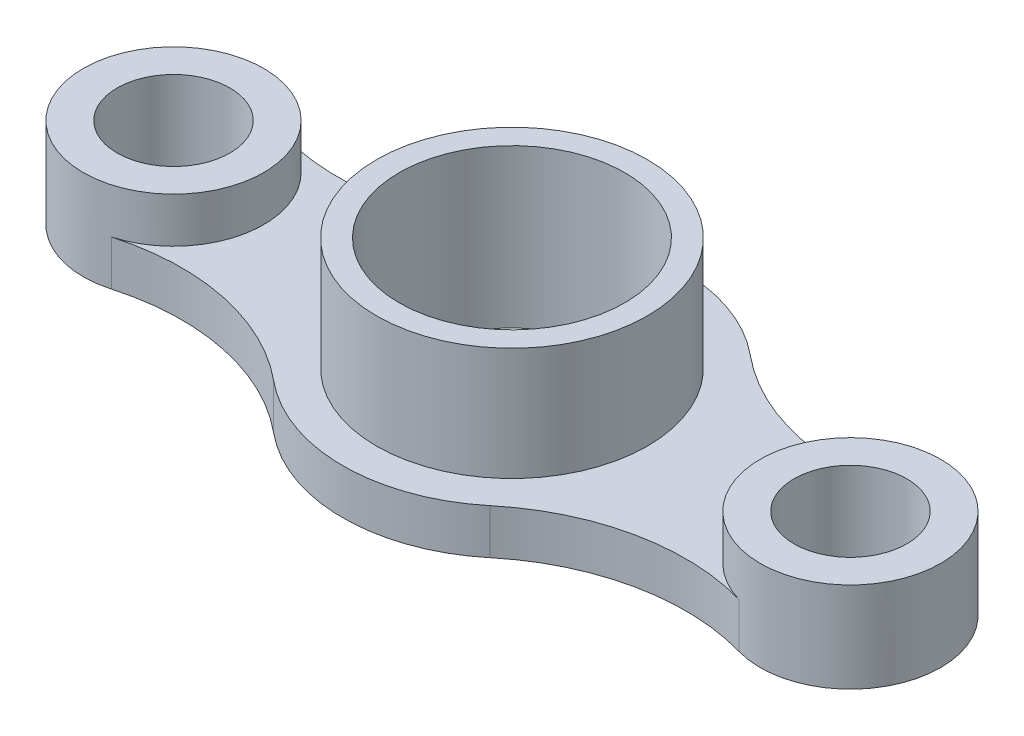
ISO-10303-21;
HEADER;
FILE_DESCRIPTION(('STEP AP214'),'2;1');
FILE_NAME('part.step','',(''),(''),'','','');
FILE_SCHEMA(('AUTOMOTIVE_DESIGN { 1 0 10303 214 1 1 1 1 }'));
ENDSEC;
DATA;
#1=APPLICATION_CONTEXT('core data for automotive mechanical design processes');
#2=APPLICATION_PROTOCOL_DEFINITION('international standard','automotive_design',2000,#1);
#3=PRODUCT_CONTEXT('',#1,'mechanical');
#4=PRODUCT('Part','Part','',(#3));
#5=PRODUCT_RELATED_PRODUCT_CATEGORY('part','',(#4));
#6=PRODUCT_DEFINITION_FORMATION('','',#4);
#7=PRODUCT_DEFINITION_CONTEXT('part definition',#1,'design');
#8=PRODUCT_DEFINITION('design','',#6,#7);
#9=PRODUCT_DEFINITION_SHAPE('','',#8);
#10=(LENGTH_UNIT() NAMED_UNIT(*) SI_UNIT(.MILLI.,.METRE.));
#11=(NAMED_UNIT(*) PLANE_ANGLE_UNIT() SI_UNIT($,.RADIAN.));
#12=(NAMED_UNIT(*) SI_UNIT($,.STERADIAN.) SOLID_ANGLE_UNIT());
#13=UNCERTAINTY_MEASURE_WITH_UNIT(LENGTH_MEASURE(1.E-05),#10,'distance_accuracy_value','');
#14=(GEOMETRIC_REPRESENTATION_CONTEXT(3) GLOBAL_UNCERTAINTY_ASSIGNED_CONTEXT((#13)) GLOBAL_UNIT_ASSIGNED_CONTEXT((#10,
#11,#12)) REPRESENTATION_CONTEXT('',''));
#15=CARTESIAN_POINT('',(0.,0.,0.));
#16=DIRECTION('',(0.,0.,1.));
#17=DIRECTION('',(1.,0.,0.));
#18=AXIS2_PLACEMENT_3D('',#15,#16,#17);
#19=CARTESIAN_POINT('',(0.,20.,0.));
#20=DIRECTION('',(0.,-1.,0.));
#21=DIRECTION('',(0.,0.,-1.));
#22=AXIS2_PLACEMENT_3D('',#19,#20,#21);
#23=CYLINDRICAL_SURFACE('',#22,75.0000000000001);
#24=CARTESIAN_POINT('',(0.,0.,0.));
#25=DIRECTION('',(0.,1.,0.));
#26=DIRECTION('',(0.,0.,1.));
#27=AXIS2_PLACEMENT_3D('',#24,#25,#26);
#28=CIRCLE('',#27,75.0000000000001);
#29=CARTESIAN_POINT('',(-47.8928571428572,0.,57.7171918469176));
#30=VERTEX_POINT('',#29);
#31=CARTESIAN_POINT('',(47.8928571428575,0.,57.7171918469174));
#32=VERTEX_POINT('',#31);
#33=EDGE_CURVE('E138',#30,#32,#28,.T.);
#34=ORIENTED_EDGE('',*,*,#33,.T.);
#35=DIRECTION('',(0.,-1.,0.));
#36=VECTOR('',#35,1.);
#37=CARTESIAN_POINT('',(47.8928571428575,20.,57.7171918469174));
#38=LINE('',#37,#36);
#39=CARTESIAN_POINT('',(47.8928571428575,20.,57.7171918469174));
#40=VERTEX_POINT('',#39);
#41=EDGE_CURVE('E11',#40,#32,#38,.T.);
#42=ORIENTED_EDGE('',*,*,#41,.F.);
#43=CARTESIAN_POINT('',(0.,20.,0.));
#44=DIRECTION('',(0.,1.,0.));
#45=DIRECTION('',(0.,0.,1.));
#46=AXIS2_PLACEMENT_3D('',#43,#44,#45);
#47=CIRCLE('',#46,75.0000000000001);
#48=CARTESIAN_POINT('',(-47.8928571428572,20.,57.7171918469176));
#49=VERTEX_POINT('',#48);
#50=EDGE_CURVE('E91',#49,#40,#47,.T.);
#51=ORIENTED_EDGE('',*,*,#50,.F.);
#52=DIRECTION('',(0.,-1.,0.));
#53=VECTOR('',#52,1.);
#54=CARTESIAN_POINT('',(-47.8928571428572,20.,57.7171918469176));
#55=LINE('',#54,#53);
#56=EDGE_CURVE('E137',#49,#30,#55,.T.);
#57=ORIENTED_EDGE('',*,*,#56,.T.);
#58=EDGE_LOOP('',(#34,#42,#51,#57));
#59=FACE_BOUND('',#58,.T.);
#60=ADVANCED_FACE('F39',(#59),#23,.T.);
#61=CARTESIAN_POINT('',(111.750000000001,20.,134.673447642807));
#62=DIRECTION('',(0.,-1.,0.));
#63=DIRECTION('',(0.,0.,-1.));
#64=AXIS2_PLACEMENT_3D('',#61,#62,#63);
#65=CYLINDRICAL_SURFACE('',#64,100.000000000001);
#66=CARTESIAN_POINT('',(111.750000000001,0.,134.673447642807));
#67=DIRECTION('',(0.,1.,0.));
#68=DIRECTION('',(0.,0.,1.));
#69=AXIS2_PLACEMENT_3D('',#66,#67,#68);
#70=CIRCLE('',#69,100.000000000001);
#71=CARTESIAN_POINT('',(139.071428571429,0.,38.4781278979438));
#72=VERTEX_POINT('',#71);
#73=EDGE_CURVE('E141',#72,#32,#70,.T.);
#74=ORIENTED_EDGE('',*,*,#73,.F.);
#75=DIRECTION('',(0.,-1.,0.));
#76=VECTOR('',#75,1.);
#77=CARTESIAN_POINT('',(139.071428571429,20.,38.4781278979438));
#78=LINE('',#77,#76);
#79=CARTESIAN_POINT('',(139.071428571429,20.,38.4781278979438));
#80=VERTEX_POINT('',#79);
#81=EDGE_CURVE('E47',#80,#72,#78,.T.);
#82=ORIENTED_EDGE('',*,*,#81,.F.);
#83=CARTESIAN_POINT('',(111.750000000001,20.,134.673447642807));
#84=DIRECTION('',(0.,1.,0.));
#85=DIRECTION('',(0.,0.,1.));
#86=AXIS2_PLACEMENT_3D('',#83,#84,#85);
#87=CIRCLE('',#86,100.000000000001);
#88=EDGE_CURVE('E196',#80,#40,#87,.T.);
#89=ORIENTED_EDGE('',*,*,#88,.T.);
#90=ORIENTED_EDGE('',*,*,#41,.T.);
#91=EDGE_LOOP('',(#74,#82,#89,#90));
#92=FACE_BOUND('',#91,.T.);
#93=ADVANCED_FACE('F197',(#92),#65,.F.);
#94=CARTESIAN_POINT('',(111.749999999999,20.,-134.673447642807));
#95=DIRECTION('',(0.,-1.,0.));
#96=DIRECTION('',(0.,0.,-1.));
#97=AXIS2_PLACEMENT_3D('',#94,#95,#96);
#98=CYLINDRICAL_SURFACE('',#97,99.9999999999991);
#99=CARTESIAN_POINT('',(111.749999999999,0.,-134.673447642807));
#100=DIRECTION('',(0.,1.,0.));
#101=DIRECTION('',(0.,0.,1.));
#102=AXIS2_PLACEMENT_3D('',#99,#100,#101);
#103=CIRCLE('',#102,99.9999999999991);
#104=CARTESIAN_POINT('',(139.071428571428,0.,-38.4781278979463));
#105=VERTEX_POINT('',#104);
#106=CARTESIAN_POINT('',(47.8928571428572,0.,-57.7171918469179));
#107=VERTEX_POINT('',#106);
#108=EDGE_CURVE('E119',#105,#107,#103,.F.);
#109=ORIENTED_EDGE('',*,*,#108,.T.);
#110=DIRECTION('',(0.,-1.,0.));
#111=VECTOR('',#110,1.);
#112=CARTESIAN_POINT('',(47.8928571428572,20.,-57.7171918469179));
#113=LINE('',#112,#111);
#114=CARTESIAN_POINT('',(47.8928571428572,20.,-57.7171918469179));
#115=VERTEX_POINT('',#114);
#116=EDGE_CURVE('E116',#115,#107,#113,.T.);
#117=ORIENTED_EDGE('',*,*,#116,.F.);
#118=CARTESIAN_POINT('',(111.749999999999,20.,-134.673447642807));
#119=DIRECTION('',(0.,1.,0.));
#120=DIRECTION('',(0.,0.,1.));
#121=AXIS2_PLACEMENT_3D('',#118,#119,#120);
#122=CIRCLE('',#121,99.9999999999991);
#123=CARTESIAN_POINT('',(139.071428571428,20.,-38.4781278979462));
#124=VERTEX_POINT('',#123);
#125=EDGE_CURVE('E102',#124,#115,#122,.F.);
#126=ORIENTED_EDGE('',*,*,#125,.F.);
#127=DIRECTION('',(0.,-1.,0.));
#128=VECTOR('',#127,1.);
#129=CARTESIAN_POINT('',(139.071428571428,20.,-38.4781278979462));
#130=LINE('',#129,#128);
#131=EDGE_CURVE('E123',#124,#105,#130,.T.);
#132=ORIENTED_EDGE('',*,*,#131,.T.);
#133=EDGE_LOOP('',(#109,#117,#126,#132));
#134=FACE_BOUND('',#133,.T.);
#135=ADVANCED_FACE('F117',(#134),#98,.F.);
#136=CARTESIAN_POINT('',(0.,20.,0.));
#137=DIRECTION('',(0.,-1.,0.));
#138=DIRECTION('',(0.,0.,-1.));
#139=AXIS2_PLACEMENT_3D('',#136,#137,#138);
#140=CYLINDRICAL_SURFACE('',#139,74.9999999999999);
#141=CARTESIAN_POINT('',(0.,0.,0.));
#142=DIRECTION('',(0.,1.,0.));
#143=DIRECTION('',(0.,0.,1.));
#144=AXIS2_PLACEMENT_3D('',#141,#142,#143);
#145=CIRCLE('',#144,74.9999999999999);
#146=CARTESIAN_POINT('',(-47.8928571428571,0.,-57.7171918469175));
#147=VERTEX_POINT('',#146);
#148=EDGE_CURVE('E146',#107,#147,#145,.T.);
#149=ORIENTED_EDGE('',*,*,#148,.T.);
#150=DIRECTION('',(0.,-1.,0.));
#151=VECTOR('',#150,1.);
#152=CARTESIAN_POINT('',(-47.8928571428571,20.,-57.7171918469175));
#153=LINE('',#152,#151);
#154=CARTESIAN_POINT('',(-47.8928571428571,20.,-57.7171918469175));
#155=VERTEX_POINT('',#154);
#156=EDGE_CURVE('E124',#155,#147,#153,.T.);
#157=ORIENTED_EDGE('',*,*,#156,.F.);
#158=CARTESIAN_POINT('',(0.,20.,0.));
#159=DIRECTION('',(0.,1.,0.));
#160=DIRECTION('',(0.,0.,1.));
#161=AXIS2_PLACEMENT_3D('',#158,#159,#160);
#162=CIRCLE('',#161,74.9999999999999);
#163=EDGE_CURVE('E107',#115,#155,#162,.T.);
#164=ORIENTED_EDGE('',*,*,#163,.F.);
#165=ORIENTED_EDGE('',*,*,#116,.T.);
#166=EDGE_LOOP('',(#149,#157,#164,#165));
#167=FACE_BOUND('',#166,.T.);
#168=ADVANCED_FACE('F126',(#167),#140,.T.);
#169=CARTESIAN_POINT('',(-111.75,20.,-134.673447642807));
#170=DIRECTION('',(0.,-1.,0.));
#171=DIRECTION('',(0.,0.,-1.));
#172=AXIS2_PLACEMENT_3D('',#169,#170,#171);
#173=CYLINDRICAL_SURFACE('',#172,100.);
#174=CARTESIAN_POINT('',(-111.75,0.,-134.673447642807));
#175=DIRECTION('',(0.,1.,0.));
#176=DIRECTION('',(0.,0.,1.));
#177=AXIS2_PLACEMENT_3D('',#174,#175,#176);
#178=CIRCLE('',#177,100.);
#179=CARTESIAN_POINT('',(-139.071428571429,0.,-38.478127897945));
#180=VERTEX_POINT('',#179);
#181=EDGE_CURVE('E148',#180,#147,#178,.T.);
#182=ORIENTED_EDGE('',*,*,#181,.F.);
#183=DIRECTION('',(0.,-1.,0.));
#184=VECTOR('',#183,1.);
#185=CARTESIAN_POINT('',(-139.071428571429,20.,-38.478127897945));
#186=LINE('',#185,#184);
#187=CARTESIAN_POINT('',(-139.071428571429,20.,-38.478127897945));
#188=VERTEX_POINT('',#187);
#189=EDGE_CURVE('E155',#188,#180,#186,.T.);
#190=ORIENTED_EDGE('',*,*,#189,.F.);
#191=CARTESIAN_POINT('',(-111.75,20.,-134.673447642807));
#192=DIRECTION('',(0.,1.,0.));
#193=DIRECTION('',(0.,0.,1.));
#194=AXIS2_PLACEMENT_3D('',#191,#192,#193);
#195=CIRCLE('',#194,100.);
#196=EDGE_CURVE('E128',#188,#155,#195,.T.);
#197=ORIENTED_EDGE('',*,*,#196,.T.);
#198=ORIENTED_EDGE('',*,*,#156,.T.);
#199=EDGE_LOOP('',(#182,#190,#197,#198));
#200=FACE_BOUND('',#199,.T.);
#201=ADVANCED_FACE('F210',(#200),#173,.F.);
#202=CARTESIAN_POINT('',(-111.75,20.,134.673447642807));
#203=DIRECTION('',(0.,-1.,0.));
#204=DIRECTION('',(0.,0.,-1.));
#205=AXIS2_PLACEMENT_3D('',#202,#203,#204);
#206=CYLINDRICAL_SURFACE('',#205,100.);
#207=CARTESIAN_POINT('',(-111.75,0.,134.673447642807));
#208=DIRECTION('',(0.,1.,0.));
#209=DIRECTION('',(0.,0.,1.));
#210=AXIS2_PLACEMENT_3D('',#207,#208,#209);
#211=CIRCLE('',#210,100.);
#212=CARTESIAN_POINT('',(-139.071428571429,0.,38.478127897945));
#213=VERTEX_POINT('',#212);
#214=EDGE_CURVE('E85',#213,#30,#211,.F.);
#215=ORIENTED_EDGE('',*,*,#214,.T.);
#216=ORIENTED_EDGE('',*,*,#56,.F.);
#217=CARTESIAN_POINT('',(-111.75,20.,134.673447642807));
#218=DIRECTION('',(0.,1.,0.));
#219=DIRECTION('',(0.,0.,1.));
#220=AXIS2_PLACEMENT_3D('',#217,#218,#219);
#221=CIRCLE('',#220,100.);
#222=CARTESIAN_POINT('',(-139.071428571429,20.,38.478127897945));
#223=VERTEX_POINT('',#222);
#224=EDGE_CURVE('E55',#223,#49,#221,.F.);
#225=ORIENTED_EDGE('',*,*,#224,.F.);
#226=DIRECTION('',(0.,-1.,0.));
#227=VECTOR('',#226,1.);
#228=CARTESIAN_POINT('',(-139.071428571429,20.,38.478127897945));
#229=LINE('',#228,#227);
#230=EDGE_CURVE('E153',#223,#213,#229,.T.);
#231=ORIENTED_EDGE('',*,*,#230,.T.);
#232=EDGE_LOOP('',(#215,#216,#225,#231));
#233=FACE_BOUND('',#232,.T.);
#234=ADVANCED_FACE('F207',(#233),#206,.F.);
#235=CARTESIAN_POINT('',(0.,20.,0.));
#236=DIRECTION('',(0.,1.,0.));
#237=DIRECTION('',(0.,0.,1.));
#238=AXIS2_PLACEMENT_3D('',#235,#236,#237);
#239=PLANE('',#238);
#240=CARTESIAN_POINT('',(0.,20.,0.));
#241=DIRECTION('',(0.,1.,0.));
#242=DIRECTION('',(0.,0.,1.));
#243=AXIS2_PLACEMENT_3D('',#240,#241,#242);
#244=CIRCLE('',#243,60.);
#245=CARTESIAN_POINT('',(0.,20.,60.));
#246=VERTEX_POINT('',#245);
#247=EDGE_CURVE('E151',#246,#246,#244,.T.);
#248=ORIENTED_EDGE('',*,*,#247,.F.);
#249=EDGE_LOOP('',(#248));
#250=FACE_BOUND('',#249,.T.);
#251=ORIENTED_EDGE('',*,*,#50,.T.);
#252=ORIENTED_EDGE('',*,*,#88,.F.);
#253=CARTESIAN_POINT('',(150.,20.,-1.77635683940025E-12));
#254=DIRECTION('',(0.,1.,0.));
#255=DIRECTION('',(0.,0.,1.));
#256=AXIS2_PLACEMENT_3D('',#253,#254,#255);
#257=CIRCLE('',#256,39.9999999999996);
#258=EDGE_CURVE('E110',#80,#124,#257,.F.);
#259=ORIENTED_EDGE('',*,*,#258,.T.);
#260=ORIENTED_EDGE('',*,*,#125,.T.);
#261=ORIENTED_EDGE('',*,*,#163,.T.);
#262=ORIENTED_EDGE('',*,*,#196,.F.);
#263=CARTESIAN_POINT('',(-150.,20.,0.));
#264=DIRECTION('',(0.,1.,0.));
#265=DIRECTION('',(0.,0.,1.));
#266=AXIS2_PLACEMENT_3D('',#263,#264,#265);
#267=CIRCLE('',#266,40.);
#268=EDGE_CURVE('E130',#223,#188,#267,.T.);
#269=ORIENTED_EDGE('',*,*,#268,.F.);
#270=ORIENTED_EDGE('',*,*,#224,.T.);
#271=EDGE_LOOP('',(#251,#252,#259,#260,#261,#262,#269,#270));
#272=FACE_BOUND('',#271,.T.);
#273=ADVANCED_FACE('F104',(#250,#272),#239,.T.);
#274=CARTESIAN_POINT('',(0.,0.,0.));
#275=DIRECTION('',(0.,1.,0.));
#276=DIRECTION('',(0.,0.,1.));
#277=AXIS2_PLACEMENT_3D('',#274,#275,#276);
#278=PLANE('',#277);
#279=ORIENTED_EDGE('',*,*,#33,.F.);
#280=ORIENTED_EDGE('',*,*,#214,.F.);
#281=CARTESIAN_POINT('',(-150.,0.,0.));
#282=DIRECTION('',(0.,1.,0.));
#283=DIRECTION('',(0.,0.,1.));
#284=AXIS2_PLACEMENT_3D('',#281,#282,#283);
#285=CIRCLE('',#284,40.);
#286=EDGE_CURVE('E79',#180,#213,#285,.T.);
#287=ORIENTED_EDGE('',*,*,#286,.F.);
#288=ORIENTED_EDGE('',*,*,#181,.T.);
#289=ORIENTED_EDGE('',*,*,#148,.F.);
#290=ORIENTED_EDGE('',*,*,#108,.F.);
#291=CARTESIAN_POINT('',(150.,0.,-1.77635683940025E-12));
#292=DIRECTION('',(0.,1.,0.));
#293=DIRECTION('',(0.,0.,1.));
#294=AXIS2_PLACEMENT_3D('',#291,#292,#293);
#295=CIRCLE('',#294,39.9999999999996);
#296=EDGE_CURVE('E165',#105,#72,#295,.F.);
#297=ORIENTED_EDGE('',*,*,#296,.T.);
#298=ORIENTED_EDGE('',*,*,#73,.T.);
#299=EDGE_LOOP('',(#279,#280,#287,#288,#289,#290,#297,#298));
#300=FACE_BOUND('',#299,.T.);
#301=CARTESIAN_POINT('',(-150.,0.,0.));
#302=DIRECTION('',(0.,1.,0.));
#303=DIRECTION('',(0.,0.,1.));
#304=AXIS2_PLACEMENT_3D('',#301,#302,#303);
#305=CIRCLE('',#304,25.);
#306=CARTESIAN_POINT('',(-150.,0.,25.));
#307=VERTEX_POINT('',#306);
#308=EDGE_CURVE('E189',#307,#307,#305,.T.);
#309=ORIENTED_EDGE('',*,*,#308,.T.);
#310=EDGE_LOOP('',(#309));
#311=FACE_BOUND('',#310,.T.);
#312=CARTESIAN_POINT('',(150.,0.,-1.77635683940025E-12));
#313=DIRECTION('',(0.,1.,0.));
#314=DIRECTION('',(0.,0.,1.));
#315=AXIS2_PLACEMENT_3D('',#312,#313,#314);
#316=CIRCLE('',#315,24.9999999999996);
#317=CARTESIAN_POINT('',(150.,0.,24.9999999999978));
#318=VERTEX_POINT('',#317);
#319=EDGE_CURVE('E171',#318,#318,#316,.F.);
#320=ORIENTED_EDGE('',*,*,#319,.F.);
#321=EDGE_LOOP('',(#320));
#322=FACE_BOUND('',#321,.T.);
#323=CARTESIAN_POINT('',(0.,0.,0.));
#324=DIRECTION('',(0.,1.,0.));
#325=DIRECTION('',(0.,0.,1.));
#326=AXIS2_PLACEMENT_3D('',#323,#324,#325);
#327=CIRCLE('',#326,50.);
#328=CARTESIAN_POINT('',(0.,0.,50.));
#329=VERTEX_POINT('',#328);
#330=EDGE_CURVE('E420',#329,#329,#327,.T.);
#331=ORIENTED_EDGE('',*,*,#330,.T.);
#332=EDGE_LOOP('',(#331));
#333=FACE_BOUND('',#332,.T.);
#334=ADVANCED_FACE('F169',(#300,#311,#322,#333),#278,.F.);
#335=CARTESIAN_POINT('',(-150.,40.,0.));
#336=DIRECTION('',(0.,-1.,0.));
#337=DIRECTION('',(0.,0.,-1.));
#338=AXIS2_PLACEMENT_3D('',#335,#336,#337);
#339=CYLINDRICAL_SURFACE('',#338,40.);
#340=CARTESIAN_POINT('',(-150.,40.,0.));
#341=DIRECTION('',(0.,1.,0.));
#342=DIRECTION('',(0.,0.,1.));
#343=AXIS2_PLACEMENT_3D('',#340,#341,#342);
#344=CIRCLE('',#343,40.);
#345=CARTESIAN_POINT('',(-150.,40.,40.));
#346=VERTEX_POINT('',#345);
#347=EDGE_CURVE('E142',#346,#346,#344,.T.);
#348=ORIENTED_EDGE('',*,*,#347,.F.);
#349=EDGE_LOOP('',(#348));
#350=FACE_BOUND('',#349,.T.);
#351=ORIENTED_EDGE('',*,*,#268,.T.);
#352=ORIENTED_EDGE('',*,*,#189,.T.);
#353=ORIENTED_EDGE('',*,*,#286,.T.);
#354=ORIENTED_EDGE('',*,*,#230,.F.);
#355=EDGE_LOOP('',(#351,#352,#353,#354));
#356=FACE_BOUND('',#355,.T.);
#357=ADVANCED_FACE('F206',(#350,#356),#339,.T.);
#358=CARTESIAN_POINT('',(-150.,40.,0.));
#359=DIRECTION('',(0.,-1.,0.));
#360=DIRECTION('',(0.,0.,-1.));
#361=AXIS2_PLACEMENT_3D('',#358,#359,#360);
#362=CYLINDRICAL_SURFACE('',#361,25.);
#363=CARTESIAN_POINT('',(-150.,40.,0.));
#364=DIRECTION('',(0.,1.,0.));
#365=DIRECTION('',(0.,0.,1.));
#366=AXIS2_PLACEMENT_3D('',#363,#364,#365);
#367=CIRCLE('',#366,25.);
#368=CARTESIAN_POINT('',(-150.,40.,25.));
#369=VERTEX_POINT('',#368);
#370=EDGE_CURVE('E184',#369,#369,#367,.T.);
#371=ORIENTED_EDGE('',*,*,#370,.T.);
#372=EDGE_LOOP('',(#371));
#373=FACE_BOUND('',#372,.T.);
#374=ORIENTED_EDGE('',*,*,#308,.F.);
#375=EDGE_LOOP('',(#374));
#376=FACE_BOUND('',#375,.T.);
#377=ADVANCED_FACE('F287',(#373,#376),#362,.F.);
#378=CARTESIAN_POINT('',(0.,40.,0.));
#379=DIRECTION('',(0.,1.,0.));
#380=DIRECTION('',(0.,0.,1.));
#381=AXIS2_PLACEMENT_3D('',#378,#379,#380);
#382=PLANE('',#381);
#383=ORIENTED_EDGE('',*,*,#370,.F.);
#384=EDGE_LOOP('',(#383));
#385=FACE_BOUND('',#384,.T.);
#386=ORIENTED_EDGE('',*,*,#347,.T.);
#387=EDGE_LOOP('',(#386));
#388=FACE_BOUND('',#387,.T.);
#389=ADVANCED_FACE('F298',(#385,#388),#382,.T.);
#390=CARTESIAN_POINT('',(150.,40.,-1.77635683940025E-12));
#391=DIRECTION('',(0.,-1.,0.));
#392=DIRECTION('',(0.,0.,-1.));
#393=AXIS2_PLACEMENT_3D('',#390,#391,#392);
#394=CYLINDRICAL_SURFACE('',#393,39.9999999999996);
#395=ORIENTED_EDGE('',*,*,#258,.F.);
#396=ORIENTED_EDGE('',*,*,#81,.T.);
#397=ORIENTED_EDGE('',*,*,#296,.F.);
#398=ORIENTED_EDGE('',*,*,#131,.F.);
#399=EDGE_LOOP('',(#395,#396,#397,#398));
#400=FACE_BOUND('',#399,.T.);
#401=CARTESIAN_POINT('',(150.,40.,-1.77635683940025E-12));
#402=DIRECTION('',(0.,1.,0.));
#403=DIRECTION('',(0.,0.,1.));
#404=AXIS2_PLACEMENT_3D('',#401,#402,#403);
#405=CIRCLE('',#404,39.9999999999996);
#406=CARTESIAN_POINT('',(150.,40.,39.9999999999978));
#407=VERTEX_POINT('',#406);
#408=EDGE_CURVE('E175',#407,#407,#405,.F.);
#409=ORIENTED_EDGE('',*,*,#408,.T.);
#410=EDGE_LOOP('',(#409));
#411=FACE_BOUND('',#410,.T.);
#412=ADVANCED_FACE('F162',(#400,#411),#394,.T.);
#413=CARTESIAN_POINT('',(150.,40.,-1.77635683940025E-12));
#414=DIRECTION('',(0.,-1.,0.));
#415=DIRECTION('',(0.,0.,-1.));
#416=AXIS2_PLACEMENT_3D('',#413,#414,#415);
#417=CYLINDRICAL_SURFACE('',#416,24.9999999999996);
#418=CARTESIAN_POINT('',(150.,40.,-1.77635683940025E-12));
#419=DIRECTION('',(0.,1.,0.));
#420=DIRECTION('',(0.,0.,1.));
#421=AXIS2_PLACEMENT_3D('',#418,#419,#420);
#422=CIRCLE('',#421,24.9999999999996);
#423=CARTESIAN_POINT('',(150.,40.,24.9999999999978));
#424=VERTEX_POINT('',#423);
#425=EDGE_CURVE('E181',#424,#424,#422,.F.);
#426=ORIENTED_EDGE('',*,*,#425,.F.);
#427=EDGE_LOOP('',(#426));
#428=FACE_BOUND('',#427,.T.);
#429=ORIENTED_EDGE('',*,*,#319,.T.);
#430=EDGE_LOOP('',(#429));
#431=FACE_BOUND('',#430,.T.);
#432=ADVANCED_FACE('F317',(#428,#431),#417,.F.);
#433=CARTESIAN_POINT('',(0.,40.,0.));
#434=DIRECTION('',(0.,1.,0.));
#435=DIRECTION('',(0.,0.,1.));
#436=AXIS2_PLACEMENT_3D('',#433,#434,#435);
#437=PLANE('',#436);
#438=ORIENTED_EDGE('',*,*,#408,.F.);
#439=EDGE_LOOP('',(#438));
#440=FACE_BOUND('',#439,.T.);
#441=ORIENTED_EDGE('',*,*,#425,.T.);
#442=EDGE_LOOP('',(#441));
#443=FACE_BOUND('',#442,.T.);
#444=ADVANCED_FACE('F326',(#440,#443),#437,.T.);
#445=CARTESIAN_POINT('',(0.,70.,0.));
#446=DIRECTION('',(0.,-1.,0.));
#447=DIRECTION('',(0.,0.,-1.));
#448=AXIS2_PLACEMENT_3D('',#445,#446,#447);
#449=CYLINDRICAL_SURFACE('',#448,50.);
#450=CARTESIAN_POINT('',(0.,70.,0.));
#451=DIRECTION('',(0.,1.,0.));
#452=DIRECTION('',(0.,0.,1.));
#453=AXIS2_PLACEMENT_3D('',#450,#451,#452);
#454=CIRCLE('',#453,50.);
#455=CARTESIAN_POINT('',(0.,70.,50.));
#456=VERTEX_POINT('',#455);
#457=EDGE_CURVE('E178',#456,#456,#454,.T.);
#458=ORIENTED_EDGE('',*,*,#457,.T.);
#459=EDGE_LOOP('',(#458));
#460=FACE_BOUND('',#459,.T.);
#461=ORIENTED_EDGE('',*,*,#330,.F.);
#462=EDGE_LOOP('',(#461));
#463=FACE_BOUND('',#462,.T.);
#464=ADVANCED_FACE('F336',(#460,#463),#449,.F.);
#465=CARTESIAN_POINT('',(0.,70.,0.));
#466=DIRECTION('',(0.,-1.,0.));
#467=DIRECTION('',(0.,0.,-1.));
#468=AXIS2_PLACEMENT_3D('',#465,#466,#467);
#469=CYLINDRICAL_SURFACE('',#468,60.);
#470=ORIENTED_EDGE('',*,*,#247,.T.);
#471=EDGE_LOOP('',(#470));
#472=FACE_BOUND('',#471,.T.);
#473=CARTESIAN_POINT('',(0.,70.,0.));
#474=DIRECTION('',(0.,1.,0.));
#475=DIRECTION('',(0.,0.,1.));
#476=AXIS2_PLACEMENT_3D('',#473,#474,#475);
#477=CIRCLE('',#476,60.);
#478=CARTESIAN_POINT('',(0.,70.,60.));
#479=VERTEX_POINT('',#478);
#480=EDGE_CURVE('E172',#479,#479,#477,.T.);
#481=ORIENTED_EDGE('',*,*,#480,.F.);
#482=EDGE_LOOP('',(#481));
#483=FACE_BOUND('',#482,.T.);
#484=ADVANCED_FACE('F347',(#472,#483),#469,.T.);
#485=CARTESIAN_POINT('',(0.,70.,0.));
#486=DIRECTION('',(0.,1.,0.));
#487=DIRECTION('',(0.,0.,1.));
#488=AXIS2_PLACEMENT_3D('',#485,#486,#487);
#489=PLANE('',#488);
#490=ORIENTED_EDGE('',*,*,#457,.F.);
#491=EDGE_LOOP('',(#490));
#492=FACE_BOUND('',#491,.T.);
#493=ORIENTED_EDGE('',*,*,#480,.T.);
#494=EDGE_LOOP('',(#493));
#495=FACE_BOUND('',#494,.T.);
#496=ADVANCED_FACE('F358',(#492,#495),#489,.T.);
#497=CLOSED_SHELL('',(#60,#93,#135,#168,#201,#234,#273,#334,#357,#377,#389,#412,#432,#444,#464,
#484,#496));
#498=MANIFOLD_SOLID_BREP('B2',#497);
#499=ADVANCED_BREP_SHAPE_REPRESENTATION('',(#18,#498),#14);
#500=SHAPE_DEFINITION_REPRESENTATION(#9,#499);
ENDSEC;
END-ISO-10303-21;
